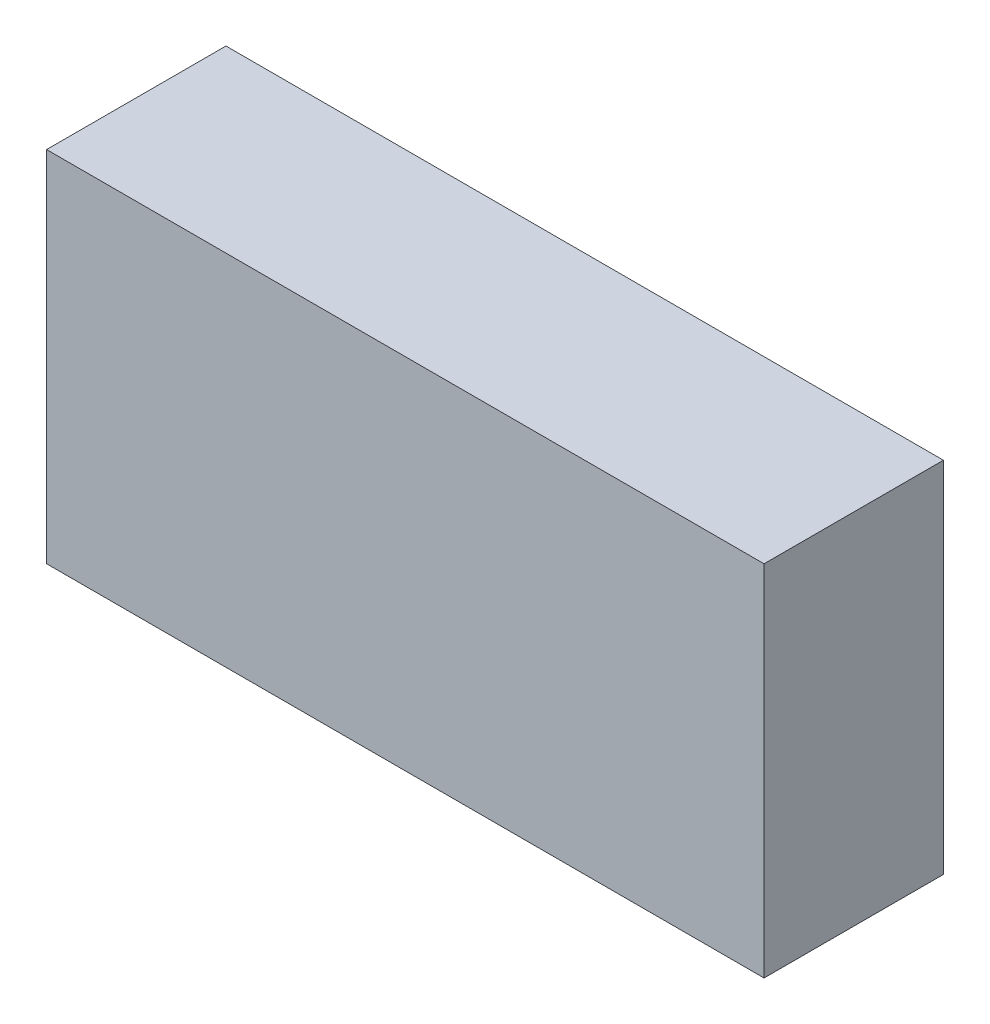
ISO-10303-21;
HEADER;
FILE_DESCRIPTION(('STEP AP214'),'2;1');
FILE_NAME('part.step','',(''),(''),'','','');
FILE_SCHEMA(('AUTOMOTIVE_DESIGN { 1 0 10303 214 1 1 1 1 }'));
ENDSEC;
DATA;
#1=APPLICATION_CONTEXT('core data for automotive mechanical design processes');
#2=APPLICATION_PROTOCOL_DEFINITION('international standard','automotive_design',2000,#1);
#3=PRODUCT_CONTEXT('',#1,'mechanical');
#4=PRODUCT('Part','Part','',(#3));
#5=PRODUCT_RELATED_PRODUCT_CATEGORY('part','',(#4));
#6=PRODUCT_DEFINITION_FORMATION('','',#4);
#7=PRODUCT_DEFINITION_CONTEXT('part definition',#1,'design');
#8=PRODUCT_DEFINITION('design','',#6,#7);
#9=PRODUCT_DEFINITION_SHAPE('','',#8);
#10=(LENGTH_UNIT() NAMED_UNIT(*) SI_UNIT(.MILLI.,.METRE.));
#11=(NAMED_UNIT(*) PLANE_ANGLE_UNIT() SI_UNIT($,.RADIAN.));
#12=(NAMED_UNIT(*) SI_UNIT($,.STERADIAN.) SOLID_ANGLE_UNIT());
#13=UNCERTAINTY_MEASURE_WITH_UNIT(LENGTH_MEASURE(1.E-05),#10,'distance_accuracy_value','');
#14=(GEOMETRIC_REPRESENTATION_CONTEXT(3) GLOBAL_UNCERTAINTY_ASSIGNED_CONTEXT((#13)) GLOBAL_UNIT_ASSIGNED_CONTEXT((#10,
#11,#12)) REPRESENTATION_CONTEXT('',''));
#15=CARTESIAN_POINT('',(0.,0.,0.));
#16=DIRECTION('',(0.,0.,1.));
#17=DIRECTION('',(1.,0.,0.));
#18=AXIS2_PLACEMENT_3D('',#15,#16,#17);
#19=CARTESIAN_POINT('',(-20.,10.,10.));
#20=DIRECTION('',(1.,0.,0.));
#21=DIRECTION('',(0.,0.,-1.));
#22=AXIS2_PLACEMENT_3D('',#19,#20,#21);
#23=PLANE('',#22);
#24=DIRECTION('',(0.,-1.,0.));
#25=VECTOR('',#24,1.);
#26=CARTESIAN_POINT('',(-20.,10.,0.));
#27=LINE('',#26,#25);
#28=CARTESIAN_POINT('',(-20.,10.,0.));
#29=VERTEX_POINT('',#28);
#30=CARTESIAN_POINT('',(-20.,-10.,0.));
#31=VERTEX_POINT('',#30);
#32=EDGE_CURVE('E105',#29,#31,#27,.T.);
#33=ORIENTED_EDGE('',*,*,#32,.T.);
#34=DIRECTION('',(0.,0.,-1.));
#35=VECTOR('',#34,1.);
#36=CARTESIAN_POINT('',(-20.,-10.,10.));
#37=LINE('',#36,#35);
#38=CARTESIAN_POINT('',(-20.,-10.,10.));
#39=VERTEX_POINT('',#38);
#40=EDGE_CURVE('E11',#39,#31,#37,.T.);
#41=ORIENTED_EDGE('',*,*,#40,.F.);
#42=DIRECTION('',(0.,-1.,0.));
#43=VECTOR('',#42,1.);
#44=CARTESIAN_POINT('',(-20.,10.,10.));
#45=LINE('',#44,#43);
#46=CARTESIAN_POINT('',(-20.,10.,10.));
#47=VERTEX_POINT('',#46);
#48=EDGE_CURVE('E89',#47,#39,#45,.T.);
#49=ORIENTED_EDGE('',*,*,#48,.F.);
#50=DIRECTION('',(0.,0.,-1.));
#51=VECTOR('',#50,1.);
#52=CARTESIAN_POINT('',(-20.,10.,10.));
#53=LINE('',#52,#51);
#54=EDGE_CURVE('E97',#47,#29,#53,.T.);
#55=ORIENTED_EDGE('',*,*,#54,.T.);
#56=EDGE_LOOP('',(#33,#41,#49,#55));
#57=FACE_BOUND('',#56,.T.);
#58=ADVANCED_FACE('F39',(#57),#23,.F.);
#59=CARTESIAN_POINT('',(-20.,-10.,10.));
#60=DIRECTION('',(0.,1.,0.));
#61=DIRECTION('',(0.,0.,1.));
#62=AXIS2_PLACEMENT_3D('',#59,#60,#61);
#63=PLANE('',#62);
#64=DIRECTION('',(1.,0.,0.));
#65=VECTOR('',#64,1.);
#66=CARTESIAN_POINT('',(-20.,-10.,0.));
#67=LINE('',#66,#65);
#68=CARTESIAN_POINT('',(20.,-10.,0.));
#69=VERTEX_POINT('',#68);
#70=EDGE_CURVE('E92',#31,#69,#67,.T.);
#71=ORIENTED_EDGE('',*,*,#70,.T.);
#72=DIRECTION('',(0.,0.,-1.));
#73=VECTOR('',#72,1.);
#74=CARTESIAN_POINT('',(20.,-10.,10.));
#75=LINE('',#74,#73);
#76=CARTESIAN_POINT('',(20.,-10.,10.));
#77=VERTEX_POINT('',#76);
#78=EDGE_CURVE('E50',#77,#69,#75,.T.);
#79=ORIENTED_EDGE('',*,*,#78,.F.);
#80=DIRECTION('',(1.,0.,0.));
#81=VECTOR('',#80,1.);
#82=CARTESIAN_POINT('',(-20.,-10.,10.));
#83=LINE('',#82,#81);
#84=EDGE_CURVE('E82',#39,#77,#83,.T.);
#85=ORIENTED_EDGE('',*,*,#84,.F.);
#86=ORIENTED_EDGE('',*,*,#40,.T.);
#87=EDGE_LOOP('',(#71,#79,#85,#86));
#88=FACE_BOUND('',#87,.T.);
#89=ADVANCED_FACE('F93',(#88),#63,.F.);
#90=CARTESIAN_POINT('',(20.,-10.,10.));
#91=DIRECTION('',(-1.,0.,0.));
#92=DIRECTION('',(0.,0.,1.));
#93=AXIS2_PLACEMENT_3D('',#90,#91,#92);
#94=PLANE('',#93);
#95=DIRECTION('',(0.,1.,0.));
#96=VECTOR('',#95,1.);
#97=CARTESIAN_POINT('',(20.,-10.,0.));
#98=LINE('',#97,#96);
#99=CARTESIAN_POINT('',(20.,10.,0.));
#100=VERTEX_POINT('',#99);
#101=EDGE_CURVE('E74',#69,#100,#98,.T.);
#102=ORIENTED_EDGE('',*,*,#101,.T.);
#103=DIRECTION('',(0.,0.,-1.));
#104=VECTOR('',#103,1.);
#105=CARTESIAN_POINT('',(20.,10.,10.));
#106=LINE('',#105,#104);
#107=CARTESIAN_POINT('',(20.,10.,10.));
#108=VERTEX_POINT('',#107);
#109=EDGE_CURVE('E94',#108,#100,#106,.T.);
#110=ORIENTED_EDGE('',*,*,#109,.F.);
#111=DIRECTION('',(0.,1.,0.));
#112=VECTOR('',#111,1.);
#113=CARTESIAN_POINT('',(20.,-10.,10.));
#114=LINE('',#113,#112);
#115=EDGE_CURVE('E88',#77,#108,#114,.T.);
#116=ORIENTED_EDGE('',*,*,#115,.F.);
#117=ORIENTED_EDGE('',*,*,#78,.T.);
#118=EDGE_LOOP('',(#102,#110,#116,#117));
#119=FACE_BOUND('',#118,.T.);
#120=ADVANCED_FACE('F96',(#119),#94,.F.);
#121=CARTESIAN_POINT('',(20.,10.,10.));
#122=DIRECTION('',(0.,-1.,0.));
#123=DIRECTION('',(0.,0.,-1.));
#124=AXIS2_PLACEMENT_3D('',#121,#122,#123);
#125=PLANE('',#124);
#126=DIRECTION('',(-1.,0.,0.));
#127=VECTOR('',#126,1.);
#128=CARTESIAN_POINT('',(20.,10.,0.));
#129=LINE('',#128,#127);
#130=EDGE_CURVE('E76',#100,#29,#129,.T.);
#131=ORIENTED_EDGE('',*,*,#130,.T.);
#132=ORIENTED_EDGE('',*,*,#54,.F.);
#133=DIRECTION('',(-1.,0.,0.));
#134=VECTOR('',#133,1.);
#135=CARTESIAN_POINT('',(20.,10.,10.));
#136=LINE('',#135,#134);
#137=EDGE_CURVE('E54',#108,#47,#136,.T.);
#138=ORIENTED_EDGE('',*,*,#137,.F.);
#139=ORIENTED_EDGE('',*,*,#109,.T.);
#140=EDGE_LOOP('',(#131,#132,#138,#139));
#141=FACE_BOUND('',#140,.T.);
#142=ADVANCED_FACE('F106',(#141),#125,.F.);
#143=CARTESIAN_POINT('',(0.,0.,10.));
#144=DIRECTION('',(0.,0.,1.));
#145=DIRECTION('',(1.,0.,0.));
#146=AXIS2_PLACEMENT_3D('',#143,#144,#145);
#147=PLANE('',#146);
#148=ORIENTED_EDGE('',*,*,#48,.T.);
#149=ORIENTED_EDGE('',*,*,#84,.T.);
#150=ORIENTED_EDGE('',*,*,#115,.T.);
#151=ORIENTED_EDGE('',*,*,#137,.T.);
#152=EDGE_LOOP('',(#148,#149,#150,#151));
#153=FACE_BOUND('',#152,.T.);
#154=ADVANCED_FACE('F86',(#153),#147,.T.);
#155=CARTESIAN_POINT('',(0.,0.,0.));
#156=DIRECTION('',(0.,0.,1.));
#157=DIRECTION('',(1.,0.,0.));
#158=AXIS2_PLACEMENT_3D('',#155,#156,#157);
#159=PLANE('',#158);
#160=ORIENTED_EDGE('',*,*,#32,.F.);
#161=ORIENTED_EDGE('',*,*,#130,.F.);
#162=ORIENTED_EDGE('',*,*,#101,.F.);
#163=ORIENTED_EDGE('',*,*,#70,.F.);
#164=EDGE_LOOP('',(#160,#161,#162,#163));
#165=FACE_BOUND('',#164,.T.);
#166=ADVANCED_FACE('F115',(#165),#159,.F.);
#167=CLOSED_SHELL('',(#58,#89,#120,#142,#154,#166));
#168=MANIFOLD_SOLID_BREP('B2',#167);
#169=ADVANCED_BREP_SHAPE_REPRESENTATION('',(#18,#168),#14);
#170=SHAPE_DEFINITION_REPRESENTATION(#9,#169);
ENDSEC;
END-ISO-10303-21;
